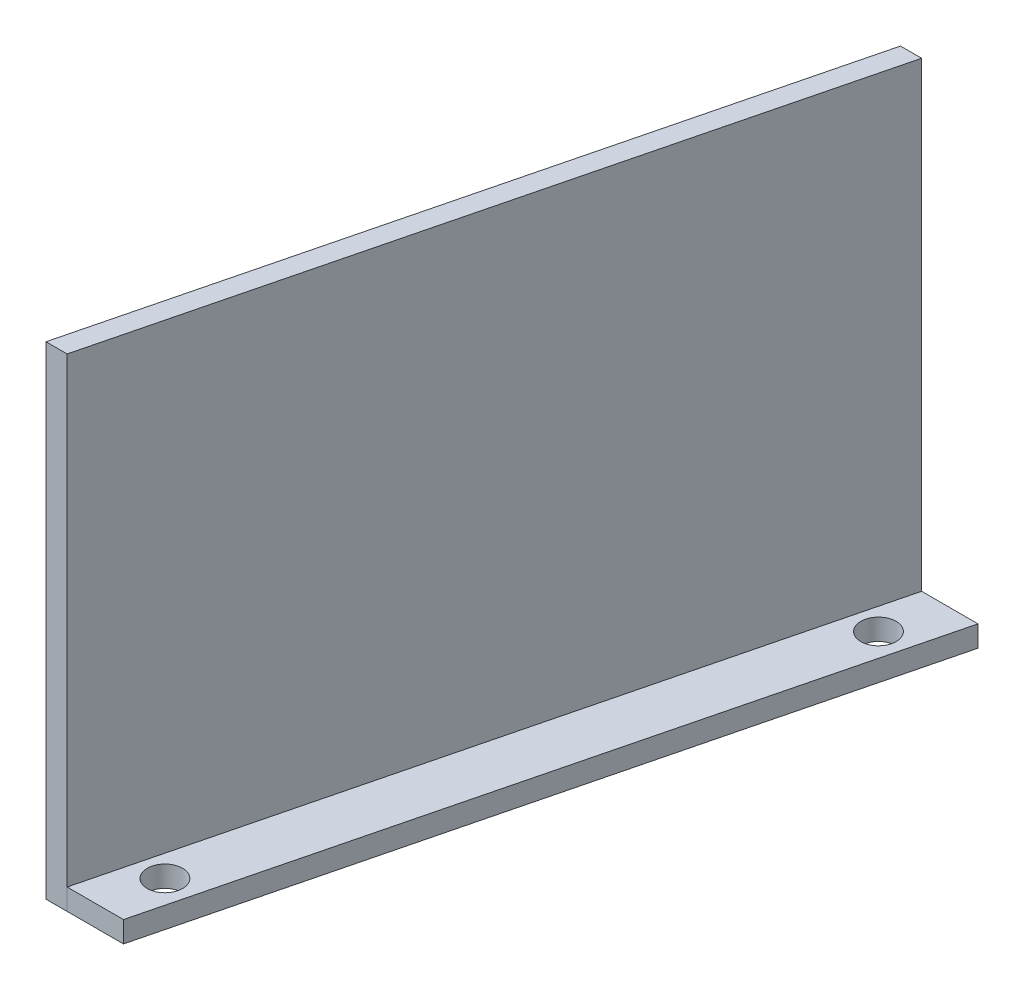
ISO-10303-21;
HEADER;
FILE_DESCRIPTION(('STEP AP214'),'2;1');
FILE_NAME('part.step','',(''),(''),'','','');
FILE_SCHEMA(('AUTOMOTIVE_DESIGN { 1 0 10303 214 1 1 1 1 }'));
ENDSEC;
DATA;
#1=APPLICATION_CONTEXT('core data for automotive mechanical design processes');
#2=APPLICATION_PROTOCOL_DEFINITION('international standard','automotive_design',2000,#1);
#3=PRODUCT_CONTEXT('',#1,'mechanical');
#4=PRODUCT('Part','Part','',(#3));
#5=PRODUCT_RELATED_PRODUCT_CATEGORY('part','',(#4));
#6=PRODUCT_DEFINITION_FORMATION('','',#4);
#7=PRODUCT_DEFINITION_CONTEXT('part definition',#1,'design');
#8=PRODUCT_DEFINITION('design','',#6,#7);
#9=PRODUCT_DEFINITION_SHAPE('','',#8);
#10=(LENGTH_UNIT() NAMED_UNIT(*) SI_UNIT(.MILLI.,.METRE.));
#11=(NAMED_UNIT(*) PLANE_ANGLE_UNIT() SI_UNIT($,.RADIAN.));
#12=(NAMED_UNIT(*) SI_UNIT($,.STERADIAN.) SOLID_ANGLE_UNIT());
#13=UNCERTAINTY_MEASURE_WITH_UNIT(LENGTH_MEASURE(1.E-05),#10,'distance_accuracy_value','');
#14=(GEOMETRIC_REPRESENTATION_CONTEXT(3) GLOBAL_UNCERTAINTY_ASSIGNED_CONTEXT((#13)) GLOBAL_UNIT_ASSIGNED_CONTEXT((#10,
#11,#12)) REPRESENTATION_CONTEXT('',''));
#15=CARTESIAN_POINT('',(0.,0.,0.));
#16=DIRECTION('',(0.,0.,1.));
#17=DIRECTION('',(1.,0.,0.));
#18=AXIS2_PLACEMENT_3D('',#15,#16,#17);
#19=CARTESIAN_POINT('',(-98.2526817852329,0.00164452532082819,-25.3597597626838));
#20=DIRECTION('',(0.970037387299631,-1.57551485791552E-05,0.242955689360594));
#21=DIRECTION('',(0.242955689390748,0.,-0.970037387420025));
#22=AXIS2_PLACEMENT_3D('',#19,#20,#21);
#23=PLANE('',#22);
#24=CARTESIAN_POINT('',(-138.338729865804,20.4768370750835,134.693213904972));
#25=DIRECTION('',(0.,1.,0.));
#26=VECTOR('',#25,1.);
#27=LINE('',#24,#26);
#28=CARTESIAN_POINT('',(-138.338971909921,20.4768370789162,134.69315399232));
#29=VERTEX_POINT('',#28);
#30=CARTESIAN_POINT('',(-138.338468013844,86.0106418896129,134.693279488448));
#31=VERTEX_POINT('',#30);
#32=EDGE_CURVE('E230',#29,#31,#27,.T.);
#33=ORIENTED_EDGE('',*,*,#32,.F.);
#34=DIRECTION('',(0.242955689390748,0.,-0.970037387420025));
#35=VECTOR('',#34,1.);
#36=CARTESIAN_POINT('',(-98.2523688611623,20.4768370750835,-25.3596813876806));
#37=LINE('',#36,#35);
#38=CARTESIAN_POINT('',(-114.043872452513,20.4768370863623,37.6893062810384));
#39=VERTEX_POINT('',#38);
#40=EDGE_CURVE('E312',#29,#39,#37,.T.);
#41=ORIENTED_EDGE('',*,*,#40,.T.);
#42=CARTESIAN_POINT('',(-114.0421795508,86.0083643737194,37.6900009915816));
#43=DIRECTION('',(-2.96036767732586E-05,-0.999999999495679,-1.1500646359075E-05));
#44=VECTOR('',#43,1.);
#45=LINE('',#42,#44);
#46=CARTESIAN_POINT('',(-114.04244140276,86.0083643779723,37.689935408106));
#47=VERTEX_POINT('',#46);
#48=EDGE_CURVE('E328',#47,#39,#45,.T.);
#49=ORIENTED_EDGE('',*,*,#48,.F.);
#50=CARTESIAN_POINT('',(-138.338729865804,86.0106418938658,134.693213904972));
#51=DIRECTION('',(0.242966163072334,-2.27752633245577E-05,-0.970034763852923));
#52=VECTOR('',#51,1.);
#53=LINE('',#50,#52);
#54=EDGE_CURVE('E342',#31,#47,#53,.T.);
#55=ORIENTED_EDGE('',*,*,#54,.F.);
#56=EDGE_LOOP('',(#33,#41,#49,#55));
#57=FACE_BOUND('',#56,.T.);
#58=ADVANCED_FACE('F76',(#57),#23,.T.);
#59=CARTESIAN_POINT('',(-117.044208335984,17.4768370750835,37.6892128347213));
#60=DIRECTION('',(0.,1.,0.));
#61=DIRECTION('',(0.,0.,1.));
#62=AXIS2_PLACEMENT_3D('',#59,#60,#61);
#63=PLANE('',#62);
#64=DIRECTION('',(1.,0.,0.));
#65=VECTOR('',#64,1.);
#66=CARTESIAN_POINT('',(-141.338729865804,17.4768370750835,134.693213904972));
#67=LINE('',#66,#65);
#68=CARTESIAN_POINT('',(-141.338991717763,17.4768370793364,134.693148321496));
#69=VERTEX_POINT('',#68);
#70=CARTESIAN_POINT('',(-138.339130856766,17.4768370750835,134.693148321496));
#71=VERTEX_POINT('',#70);
#72=EDGE_CURVE('E12',#69,#71,#67,.T.);
#73=ORIENTED_EDGE('',*,*,#72,.F.);
#74=DIRECTION('',(0.242955689390748,0.,-0.970037387420025));
#75=VECTOR('',#74,1.);
#76=CARTESIAN_POINT('',(-101.252414710412,17.4768370835894,-25.3596928710896));
#77=LINE('',#76,#75);
#78=CARTESIAN_POINT('',(-117.043651779973,17.4768370750835,37.6892128347213));
#79=VERTEX_POINT('',#78);
#80=EDGE_CURVE('E302',#79,#69,#77,.F.);
#81=ORIENTED_EDGE('',*,*,#80,.F.);
#82=DIRECTION('',(1.,0.,0.));
#83=VECTOR('',#82,1.);
#84=CARTESIAN_POINT('',(-117.044208335984,17.4768370750835,37.6892128347213));
#85=LINE('',#84,#83);
#86=CARTESIAN_POINT('',(-114.043807345022,17.4768370750835,37.689278418197));
#87=VERTEX_POINT('',#86);
#88=EDGE_CURVE('E87',#79,#87,#85,.T.);
#89=ORIENTED_EDGE('',*,*,#88,.T.);
#90=DIRECTION('',(1.,0.,0.));
#91=VECTOR('',#90,1.);
#92=CARTESIAN_POINT('',(-114.043946484025,17.4768370750835,37.689278418197));
#93=LINE('',#92,#91);
#94=CARTESIAN_POINT('',(-106.043946484025,17.4768370750835,37.689278418197));
#95=VERTEX_POINT('',#94);
#96=EDGE_CURVE('E174',#87,#95,#93,.T.);
#97=ORIENTED_EDGE('',*,*,#96,.T.);
#98=DIRECTION('',(-0.24295045234801,0.,0.970038699075401));
#99=VECTOR('',#98,1.);
#100=CARTESIAN_POINT('',(-106.043946484025,17.4768370750835,37.689278418197));
#101=LINE('',#100,#99);
#102=CARTESIAN_POINT('',(-130.338991717763,17.4768370750835,134.693148321496));
#103=VERTEX_POINT('',#102);
#104=EDGE_CURVE('E156',#95,#103,#101,.T.);
#105=ORIENTED_EDGE('',*,*,#104,.T.);
#106=DIRECTION('',(-1.,0.,0.));
#107=VECTOR('',#106,1.);
#108=CARTESIAN_POINT('',(-138.338991717763,17.4768370750835,134.693148321496));
#109=LINE('',#108,#107);
#110=EDGE_CURVE('E423',#103,#71,#109,.T.);
#111=ORIENTED_EDGE('',*,*,#110,.T.);
#112=EDGE_LOOP('',(#73,#81,#89,#97,#105,#111));
#113=FACE_BOUND('',#112,.T.);
#114=CARTESIAN_POINT('',(-112.171128445372,17.4768370750835,45.689278418197));
#115=DIRECTION('',(0.,-1.,0.));
#116=DIRECTION('',(0.,0.,-1.));
#117=AXIS2_PLACEMENT_3D('',#114,#115,#116);
#118=CIRCLE('',#117,2.5);
#119=CARTESIAN_POINT('',(-112.171128445372,17.4768370750835,43.189278418197));
#120=VERTEX_POINT('',#119);
#121=EDGE_CURVE('E405',#120,#120,#118,.T.);
#122=ORIENTED_EDGE('',*,*,#121,.F.);
#123=EDGE_LOOP('',(#122));
#124=FACE_BOUND('',#123,.T.);
#125=CARTESIAN_POINT('',(-132.458903411159,17.4768370750835,126.693148321496));
#126=DIRECTION('',(0.,-1.,0.));
#127=DIRECTION('',(0.,0.,-1.));
#128=AXIS2_PLACEMENT_3D('',#125,#126,#127);
#129=CIRCLE('',#128,2.5);
#130=CARTESIAN_POINT('',(-132.458903411159,17.4768370750835,124.193148321496));
#131=VERTEX_POINT('',#130);
#132=EDGE_CURVE('E409',#131,#131,#129,.T.);
#133=ORIENTED_EDGE('',*,*,#132,.F.);
#134=EDGE_LOOP('',(#133));
#135=FACE_BOUND('',#134,.T.);
#136=ADVANCED_FACE('F203',(#113,#124,#135),#63,.F.);
#137=CARTESIAN_POINT('',(-101.252681785233,0.00164452532082819,-25.3597597626838));
#138=DIRECTION('',(0.970037387299631,-1.57551485791552E-05,0.242955689360594));
#139=DIRECTION('',(0.242955689390748,0.,-0.970037387420025));
#140=AXIS2_PLACEMENT_3D('',#137,#138,#139);
#141=PLANE('',#140);
#142=ORIENTED_EDGE('',*,*,#80,.T.);
#143=CARTESIAN_POINT('',(-141.339253569723,17.4768370835894,134.693082738021));
#144=DIRECTION('',(1.52830831660347E-05,0.999999999875888,3.82780298463088E-06));
#145=VECTOR('',#144,1.);
#146=LINE('',#143,#145);
#147=CARTESIAN_POINT('',(-141.338468013844,86.0106418896129,134.693279488448));
#148=VERTEX_POINT('',#147);
#149=EDGE_CURVE('E299',#69,#148,#146,.T.);
#150=ORIENTED_EDGE('',*,*,#149,.T.);
#151=CARTESIAN_POINT('',(-141.338206161885,86.01064188536,134.693345071924));
#152=DIRECTION('',(0.242955688979663,-2.27750932077533E-05,-0.970037387255621));
#153=VECTOR('',#152,1.);
#154=LINE('',#151,#153);
#155=CARTESIAN_POINT('',(-117.04244140276,86.0083643779723,37.689935408106));
#156=VERTEX_POINT('',#155);
#157=EDGE_CURVE('E300',#148,#156,#154,.T.);
#158=ORIENTED_EDGE('',*,*,#157,.T.);
#159=CARTESIAN_POINT('',(-117.042703254719,86.0083643822253,37.6898698246304));
#160=DIRECTION('',(-1.43200857134016E-05,-0.999999999868032,-7.67271616781496E-06));
#161=VECTOR('',#160,1.);
#162=LINE('',#159,#161);
#163=CARTESIAN_POINT('',(-117.04388059838,20.4768370867255,37.689307178241));
#164=VERTEX_POINT('',#163);
#165=EDGE_CURVE('E271',#156,#164,#162,.T.);
#166=ORIENTED_EDGE('',*,*,#165,.T.);
#167=DIRECTION('',(-1.33613418216376E-05,-0.999999999844605,-1.15006463630543E-05));
#168=VECTOR('',#167,1.);
#169=CARTESIAN_POINT('',(-117.043885278863,0.00113041536242709,37.689011852799));
#170=LINE('',#169,#168);
#171=EDGE_CURVE('E95',#164,#79,#170,.T.);
#172=ORIENTED_EDGE('',*,*,#171,.T.);
#173=EDGE_LOOP('',(#142,#150,#158,#166,#172));
#174=FACE_BOUND('',#173,.T.);
#175=ADVANCED_FACE('F201',(#174),#141,.F.);
#176=CARTESIAN_POINT('',(-141.338729865804,17.4768370750835,134.693213904972));
#177=DIRECTION('',(0.,0.,-1.));
#178=DIRECTION('',(0.,1.,0.));
#179=AXIS2_PLACEMENT_3D('',#176,#177,#178);
#180=PLANE('',#179);
#181=CARTESIAN_POINT('',(-138.338729865804,17.4768370750835,134.693213904972));
#182=DIRECTION('',(0.,1.,0.));
#183=VECTOR('',#182,1.);
#184=LINE('',#181,#183);
#185=EDGE_CURVE('E306',#71,#29,#184,.T.);
#186=ORIENTED_EDGE('',*,*,#185,.T.);
#187=ORIENTED_EDGE('',*,*,#32,.T.);
#188=DIRECTION('',(1.,0.,0.));
#189=VECTOR('',#188,1.);
#190=CARTESIAN_POINT('',(-141.338729865804,86.0106418938658,134.693213904972));
#191=LINE('',#190,#189);
#192=EDGE_CURVE('E305',#148,#31,#191,.T.);
#193=ORIENTED_EDGE('',*,*,#192,.F.);
#194=ORIENTED_EDGE('',*,*,#149,.F.);
#195=ORIENTED_EDGE('',*,*,#72,.T.);
#196=EDGE_LOOP('',(#186,#187,#193,#194,#195));
#197=FACE_BOUND('',#196,.T.);
#198=ADVANCED_FACE('F196',(#197),#180,.F.);
#199=CARTESIAN_POINT('',(-117.0421795508,86.0083643737194,37.6900009915816));
#200=DIRECTION('',(0.,-1.15006463640809E-05,0.999999999933868));
#201=DIRECTION('',(0.,-0.999999999933868,-1.15006463640809E-05));
#202=AXIS2_PLACEMENT_3D('',#199,#200,#201);
#203=PLANE('',#202);
#204=ORIENTED_EDGE('',*,*,#48,.T.);
#205=CARTESIAN_POINT('',(-114.043668206019,17.4768370750835,37.689278418197));
#206=DIRECTION('',(1.62417951936652E-05,0.999999999868102,0.));
#207=VECTOR('',#206,1.);
#208=LINE('',#205,#207);
#209=EDGE_CURVE('E143',#87,#39,#208,.T.);
#210=ORIENTED_EDGE('',*,*,#209,.F.);
#211=ORIENTED_EDGE('',*,*,#88,.F.);
#212=ORIENTED_EDGE('',*,*,#171,.F.);
#213=ORIENTED_EDGE('',*,*,#165,.F.);
#214=DIRECTION('',(1.,0.,0.));
#215=VECTOR('',#214,1.);
#216=CARTESIAN_POINT('',(-117.0421795508,86.0083643737194,37.6900009915816));
#217=LINE('',#216,#215);
#218=EDGE_CURVE('E324',#156,#47,#217,.T.);
#219=ORIENTED_EDGE('',*,*,#218,.T.);
#220=EDGE_LOOP('',(#204,#210,#211,#212,#213,#219));
#221=FACE_BOUND('',#220,.T.);
#222=ADVANCED_FACE('F200',(#221),#203,.F.);
#223=CARTESIAN_POINT('',(-141.338729865804,86.0106418938658,134.693213904972));
#224=DIRECTION('',(0.,-0.999999999724373,2.34788114477652E-05));
#225=DIRECTION('',(0.,-2.34788114477652E-05,-0.999999999724373));
#226=AXIS2_PLACEMENT_3D('',#223,#224,#225);
#227=PLANE('',#226);
#228=ORIENTED_EDGE('',*,*,#54,.T.);
#229=ORIENTED_EDGE('',*,*,#218,.F.);
#230=ORIENTED_EDGE('',*,*,#157,.F.);
#231=ORIENTED_EDGE('',*,*,#192,.T.);
#232=EDGE_LOOP('',(#228,#229,#230,#231));
#233=FACE_BOUND('',#232,.T.);
#234=ADVANCED_FACE('F254',(#233),#227,.F.);
#235=CARTESIAN_POINT('',(-138.338991717763,20.4768370750835,134.693148321496));
#236=DIRECTION('',(0.,0.,1.));
#237=DIRECTION('',(1.,0.,0.));
#238=AXIS2_PLACEMENT_3D('',#235,#236,#237);
#239=PLANE('',#238);
#240=DIRECTION('',(-1.,0.,0.));
#241=VECTOR('',#240,1.);
#242=CARTESIAN_POINT('',(-141.338991717763,20.4768370750835,134.693148321496));
#243=LINE('',#242,#241);
#244=CARTESIAN_POINT('',(-130.338991717763,20.4768370750835,134.693148321496));
#245=VERTEX_POINT('',#244);
#246=EDGE_CURVE('E150',#245,#29,#243,.T.);
#247=ORIENTED_EDGE('',*,*,#246,.T.);
#248=ORIENTED_EDGE('',*,*,#185,.F.);
#249=ORIENTED_EDGE('',*,*,#110,.F.);
#250=DIRECTION('',(0.,-1.,0.));
#251=VECTOR('',#250,1.);
#252=CARTESIAN_POINT('',(-130.338991717763,20.4768370750835,134.693148321496));
#253=LINE('',#252,#251);
#254=EDGE_CURVE('E158',#245,#103,#253,.T.);
#255=ORIENTED_EDGE('',*,*,#254,.F.);
#256=EDGE_LOOP('',(#247,#248,#249,#255));
#257=FACE_BOUND('',#256,.T.);
#258=ADVANCED_FACE('F283',(#257),#239,.T.);
#259=CARTESIAN_POINT('',(-106.043946484025,20.4768370750835,37.689278418197));
#260=DIRECTION('',(0.970038699075401,0.,0.24295045234801));
#261=DIRECTION('',(0.24295045234801,0.,-0.970038699075402));
#262=AXIS2_PLACEMENT_3D('',#259,#260,#261);
#263=PLANE('',#262);
#264=ORIENTED_EDGE('',*,*,#104,.F.);
#265=DIRECTION('',(0.,-1.,0.));
#266=VECTOR('',#265,1.);
#267=CARTESIAN_POINT('',(-106.043946484025,20.4768370750835,37.689278418197));
#268=LINE('',#267,#266);
#269=CARTESIAN_POINT('',(-106.043946484025,20.4768370750835,37.689278418197));
#270=VERTEX_POINT('',#269);
#271=EDGE_CURVE('E140',#270,#95,#268,.T.);
#272=ORIENTED_EDGE('',*,*,#271,.F.);
#273=DIRECTION('',(-0.24295045234801,0.,0.970038699075401));
#274=VECTOR('',#273,1.);
#275=CARTESIAN_POINT('',(-106.043946484025,20.4768370750835,37.689278418197));
#276=LINE('',#275,#274);
#277=EDGE_CURVE('E149',#270,#245,#276,.T.);
#278=ORIENTED_EDGE('',*,*,#277,.T.);
#279=ORIENTED_EDGE('',*,*,#254,.T.);
#280=EDGE_LOOP('',(#264,#272,#278,#279));
#281=FACE_BOUND('',#280,.T.);
#282=ADVANCED_FACE('F154',(#281),#263,.T.);
#283=CARTESIAN_POINT('',(-114.043946484025,20.4768370750835,37.689278418197));
#284=DIRECTION('',(0.,0.,-1.));
#285=DIRECTION('',(-1.,0.,0.));
#286=AXIS2_PLACEMENT_3D('',#283,#284,#285);
#287=PLANE('',#286);
#288=ORIENTED_EDGE('',*,*,#96,.F.);
#289=ORIENTED_EDGE('',*,*,#209,.T.);
#290=DIRECTION('',(1.,0.,0.));
#291=VECTOR('',#290,1.);
#292=CARTESIAN_POINT('',(-114.043946484025,20.4768370750835,37.689278418197));
#293=LINE('',#292,#291);
#294=EDGE_CURVE('E137',#39,#270,#293,.T.);
#295=ORIENTED_EDGE('',*,*,#294,.T.);
#296=ORIENTED_EDGE('',*,*,#271,.T.);
#297=EDGE_LOOP('',(#288,#289,#295,#296));
#298=FACE_BOUND('',#297,.T.);
#299=ADVANCED_FACE('F139',(#298),#287,.T.);
#300=CARTESIAN_POINT('',(0.,20.4768370750835,0.));
#301=DIRECTION('',(0.,-1.,0.));
#302=DIRECTION('',(0.,0.,-1.));
#303=AXIS2_PLACEMENT_3D('',#300,#301,#302);
#304=PLANE('',#303);
#305=ORIENTED_EDGE('',*,*,#40,.F.);
#306=ORIENTED_EDGE('',*,*,#246,.F.);
#307=ORIENTED_EDGE('',*,*,#277,.F.);
#308=ORIENTED_EDGE('',*,*,#294,.F.);
#309=EDGE_LOOP('',(#305,#306,#307,#308));
#310=FACE_BOUND('',#309,.T.);
#311=CARTESIAN_POINT('',(-112.171128445372,20.4768370750835,45.689278418197));
#312=DIRECTION('',(0.,-1.,0.));
#313=DIRECTION('',(0.,0.,-1.));
#314=AXIS2_PLACEMENT_3D('',#311,#312,#313);
#315=CIRCLE('',#314,2.5);
#316=CARTESIAN_POINT('',(-112.171128445372,20.4768370750835,43.189278418197));
#317=VERTEX_POINT('',#316);
#318=EDGE_CURVE('E402',#317,#317,#315,.T.);
#319=ORIENTED_EDGE('',*,*,#318,.T.);
#320=EDGE_LOOP('',(#319));
#321=FACE_BOUND('',#320,.T.);
#322=CARTESIAN_POINT('',(-132.458903411159,20.4768370750835,126.693148321496));
#323=DIRECTION('',(0.,-1.,0.));
#324=DIRECTION('',(0.,0.,-1.));
#325=AXIS2_PLACEMENT_3D('',#322,#323,#324);
#326=CIRCLE('',#325,2.5);
#327=CARTESIAN_POINT('',(-132.458903411159,20.4768370750835,124.193148321496));
#328=VERTEX_POINT('',#327);
#329=EDGE_CURVE('E177',#328,#328,#326,.T.);
#330=ORIENTED_EDGE('',*,*,#329,.T.);
#331=EDGE_LOOP('',(#330));
#332=FACE_BOUND('',#331,.T.);
#333=ADVANCED_FACE('F160',(#310,#321,#332),#304,.F.);
#334=CARTESIAN_POINT('',(-132.458903411159,20.4768370750835,126.693148321496));
#335=DIRECTION('',(0.,-1.,0.));
#336=DIRECTION('',(0.,0.,-1.));
#337=AXIS2_PLACEMENT_3D('',#334,#335,#336);
#338=CYLINDRICAL_SURFACE('',#337,2.5);
#339=ORIENTED_EDGE('',*,*,#329,.F.);
#340=EDGE_LOOP('',(#339));
#341=FACE_BOUND('',#340,.T.);
#342=ORIENTED_EDGE('',*,*,#132,.T.);
#343=EDGE_LOOP('',(#342));
#344=FACE_BOUND('',#343,.T.);
#345=ADVANCED_FACE('F390',(#341,#344),#338,.F.);
#346=CARTESIAN_POINT('',(-112.171128445372,20.4768370750835,45.689278418197));
#347=DIRECTION('',(0.,-1.,0.));
#348=DIRECTION('',(0.,0.,-1.));
#349=AXIS2_PLACEMENT_3D('',#346,#347,#348);
#350=CYLINDRICAL_SURFACE('',#349,2.5);
#351=ORIENTED_EDGE('',*,*,#318,.F.);
#352=EDGE_LOOP('',(#351));
#353=FACE_BOUND('',#352,.T.);
#354=ORIENTED_EDGE('',*,*,#121,.T.);
#355=EDGE_LOOP('',(#354));
#356=FACE_BOUND('',#355,.T.);
#357=ADVANCED_FACE('F393',(#353,#356),#350,.F.);
#358=CLOSED_SHELL('',(#58,#136,#175,#198,#222,#234,#258,#282,#299,#333,#345,#357));
#359=MANIFOLD_SOLID_BREP('B2',#358);
#360=ADVANCED_BREP_SHAPE_REPRESENTATION('',(#18,#359),#14);
#361=SHAPE_DEFINITION_REPRESENTATION(#9,#360);
ENDSEC;
END-ISO-10303-21;
